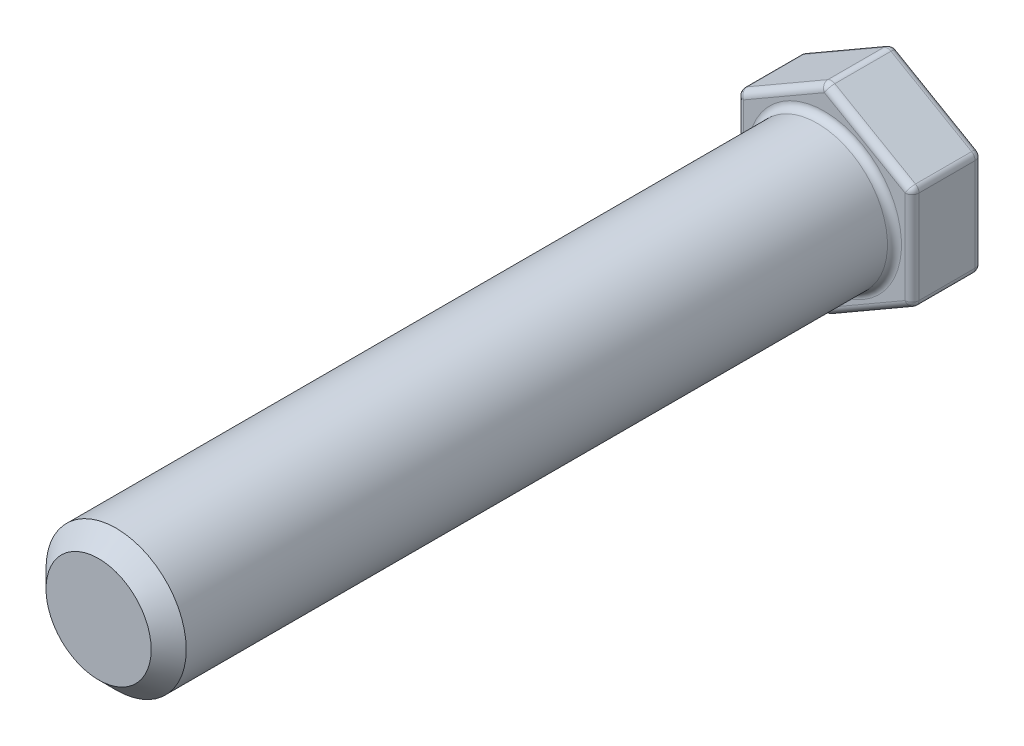
ISO-10303-21;
HEADER;
FILE_DESCRIPTION(('STEP AP214'),'2;1');
FILE_NAME('part.step','',(''),(''),'','','');
FILE_SCHEMA(('AUTOMOTIVE_DESIGN { 1 0 10303 214 1 1 1 1 }'));
ENDSEC;
DATA;
#1=APPLICATION_CONTEXT('core data for automotive mechanical design processes');
#2=APPLICATION_PROTOCOL_DEFINITION('international standard','automotive_design',2000,#1);
#3=PRODUCT_CONTEXT('',#1,'mechanical');
#4=PRODUCT('Part','Part','',(#3));
#5=PRODUCT_RELATED_PRODUCT_CATEGORY('part','',(#4));
#6=PRODUCT_DEFINITION_FORMATION('','',#4);
#7=PRODUCT_DEFINITION_CONTEXT('part definition',#1,'design');
#8=PRODUCT_DEFINITION('design','',#6,#7);
#9=PRODUCT_DEFINITION_SHAPE('','',#8);
#10=(LENGTH_UNIT() NAMED_UNIT(*) SI_UNIT(.MILLI.,.METRE.));
#11=(NAMED_UNIT(*) PLANE_ANGLE_UNIT() SI_UNIT($,.RADIAN.));
#12=(NAMED_UNIT(*) SI_UNIT($,.STERADIAN.) SOLID_ANGLE_UNIT());
#13=UNCERTAINTY_MEASURE_WITH_UNIT(LENGTH_MEASURE(1.E-05),#10,'distance_accuracy_value','');
#14=(GEOMETRIC_REPRESENTATION_CONTEXT(3) GLOBAL_UNCERTAINTY_ASSIGNED_CONTEXT((#13)) GLOBAL_UNIT_ASSIGNED_CONTEXT((#10,
#11,#12)) REPRESENTATION_CONTEXT('',''));
#15=CARTESIAN_POINT('',(0.,0.,0.));
#16=DIRECTION('',(0.,0.,1.));
#17=DIRECTION('',(1.,0.,0.));
#18=AXIS2_PLACEMENT_3D('',#15,#16,#17);
#19=CARTESIAN_POINT('',(0.,0.,20.7));
#20=DIRECTION('',(0.,0.,-1.));
#21=DIRECTION('',(-1.,0.,0.));
#22=AXIS2_PLACEMENT_3D('',#19,#20,#21);
#23=CYLINDRICAL_SURFACE('',#22,2.);
#24=CARTESIAN_POINT('',(0.,0.,20.2));
#25=DIRECTION('',(0.,0.,1.));
#26=DIRECTION('',(1.,0.,0.));
#27=AXIS2_PLACEMENT_3D('',#24,#25,#26);
#28=CIRCLE('',#27,2.);
#29=CARTESIAN_POINT('',(2.,0.,20.2));
#30=VERTEX_POINT('',#29);
#31=EDGE_CURVE('E11',#30,#30,#28,.F.);
#32=ORIENTED_EDGE('',*,*,#31,.T.);
#33=EDGE_LOOP('',(#32));
#34=FACE_BOUND('',#33,.T.);
#35=CARTESIAN_POINT('',(0.,0.,0.199999999999999));
#36=DIRECTION('',(0.,0.,-1.));
#37=DIRECTION('',(-1.,0.,0.));
#38=AXIS2_PLACEMENT_3D('',#35,#36,#37);
#39=CIRCLE('',#38,2.);
#40=CARTESIAN_POINT('',(-2.,0.,0.199999999999999));
#41=VERTEX_POINT('',#40);
#42=EDGE_CURVE('E768',#41,#41,#39,.F.);
#43=ORIENTED_EDGE('',*,*,#42,.T.);
#44=EDGE_LOOP('',(#43));
#45=FACE_BOUND('',#44,.T.);
#46=ADVANCED_FACE('F34',(#34,#45),#23,.T.);
#47=CARTESIAN_POINT('',(0.,0.,20.7));
#48=DIRECTION('',(0.,0.,1.));
#49=DIRECTION('',(1.,0.,0.));
#50=AXIS2_PLACEMENT_3D('',#47,#48,#49);
#51=PLANE('',#50);
#52=CARTESIAN_POINT('',(0.,0.,20.7));
#53=DIRECTION('',(0.,0.,1.));
#54=DIRECTION('',(1.,0.,0.));
#55=AXIS2_PLACEMENT_3D('',#52,#53,#54);
#56=CIRCLE('',#55,1.5);
#57=CARTESIAN_POINT('',(1.5,0.,20.7));
#58=VERTEX_POINT('',#57);
#59=EDGE_CURVE('E42',#58,#58,#56,.T.);
#60=ORIENTED_EDGE('',*,*,#59,.T.);
#61=EDGE_LOOP('',(#60));
#62=FACE_BOUND('',#61,.T.);
#63=ADVANCED_FACE('F296',(#62),#51,.T.);
#64=CARTESIAN_POINT('',(0.,2.88675134594813,-2.));
#65=DIRECTION('',(-0.5,-0.866025403784438,0.));
#66=DIRECTION('',(0.866025403784438,-0.5,0.));
#67=AXIS2_PLACEMENT_3D('',#64,#65,#66);
#68=PLANE('',#67);
#69=DIRECTION('',(0.866025403784438,-0.5,0.));
#70=VECTOR('',#69,1.);
#71=CARTESIAN_POINT('',(0.,2.88675134594813,-1.8));
#72=LINE('',#71,#70);
#73=CARTESIAN_POINT('',(2.4,1.50111069989303,-1.8));
#74=VERTEX_POINT('',#73);
#75=CARTESIAN_POINT('',(0.100000000000001,2.82901631902917,-1.8));
#76=VERTEX_POINT('',#75);
#77=EDGE_CURVE('E762',#74,#76,#72,.F.);
#78=ORIENTED_EDGE('',*,*,#77,.T.);
#79=DIRECTION('',(0.,0.,1.));
#80=VECTOR('',#79,1.);
#81=CARTESIAN_POINT('',(0.100000000000001,2.82901631902917,-2.));
#82=LINE('',#81,#80);
#83=CARTESIAN_POINT('',(0.100000000000001,2.82901631902917,-0.2));
#84=VERTEX_POINT('',#83);
#85=EDGE_CURVE('E241',#76,#84,#82,.T.);
#86=ORIENTED_EDGE('',*,*,#85,.T.);
#87=DIRECTION('',(0.866025403784438,-0.5,0.));
#88=VECTOR('',#87,1.);
#89=CARTESIAN_POINT('',(0.,2.88675134594813,-0.2));
#90=LINE('',#89,#88);
#91=CARTESIAN_POINT('',(2.4,1.50111069989303,-0.2));
#92=VERTEX_POINT('',#91);
#93=EDGE_CURVE('E779',#84,#92,#90,.T.);
#94=ORIENTED_EDGE('',*,*,#93,.T.);
#95=DIRECTION('',(0.,0.,1.));
#96=VECTOR('',#95,1.);
#97=CARTESIAN_POINT('',(2.4,1.50111069989303,-2.));
#98=LINE('',#97,#96);
#99=EDGE_CURVE('E239',#92,#74,#98,.F.);
#100=ORIENTED_EDGE('',*,*,#99,.T.);
#101=EDGE_LOOP('',(#78,#86,#94,#100));
#102=FACE_BOUND('',#101,.T.);
#103=ADVANCED_FACE('F314',(#102),#68,.F.);
#104=CARTESIAN_POINT('',(2.5,1.44337567297406,-2.));
#105=DIRECTION('',(-1.,0.,0.));
#106=DIRECTION('',(0.,-1.,0.));
#107=AXIS2_PLACEMENT_3D('',#104,#105,#106);
#108=PLANE('',#107);
#109=DIRECTION('',(0.,-1.,0.));
#110=VECTOR('',#109,1.);
#111=CARTESIAN_POINT('',(2.5,1.44337567297406,-0.2));
#112=LINE('',#111,#110);
#113=CARTESIAN_POINT('',(2.5,1.32790561913614,-0.2));
#114=VERTEX_POINT('',#113);
#115=CARTESIAN_POINT('',(2.5,-1.32790561913614,-0.2));
#116=VERTEX_POINT('',#115);
#117=EDGE_CURVE('E164',#114,#116,#112,.T.);
#118=ORIENTED_EDGE('',*,*,#117,.T.);
#119=DIRECTION('',(0.,0.,1.));
#120=VECTOR('',#119,1.);
#121=CARTESIAN_POINT('',(2.5,-1.32790561913614,-2.));
#122=LINE('',#121,#120);
#123=CARTESIAN_POINT('',(2.5,-1.32790561913614,-1.8));
#124=VERTEX_POINT('',#123);
#125=EDGE_CURVE('E260',#116,#124,#122,.F.);
#126=ORIENTED_EDGE('',*,*,#125,.T.);
#127=DIRECTION('',(0.,-1.,0.));
#128=VECTOR('',#127,1.);
#129=CARTESIAN_POINT('',(2.5,1.44337567297406,-1.8));
#130=LINE('',#129,#128);
#131=CARTESIAN_POINT('',(2.5,1.32790561913614,-1.8));
#132=VERTEX_POINT('',#131);
#133=EDGE_CURVE('E269',#124,#132,#130,.F.);
#134=ORIENTED_EDGE('',*,*,#133,.T.);
#135=DIRECTION('',(0.,0.,1.));
#136=VECTOR('',#135,1.);
#137=CARTESIAN_POINT('',(2.5,1.32790561913614,-2.));
#138=LINE('',#137,#136);
#139=EDGE_CURVE('E56',#132,#114,#138,.T.);
#140=ORIENTED_EDGE('',*,*,#139,.T.);
#141=EDGE_LOOP('',(#118,#126,#134,#140));
#142=FACE_BOUND('',#141,.T.);
#143=ADVANCED_FACE('F466',(#142),#108,.F.);
#144=CARTESIAN_POINT('',(2.5,-1.44337567297406,-2.));
#145=DIRECTION('',(-0.5,0.866025403784439,0.));
#146=DIRECTION('',(-0.866025403784439,-0.5,0.));
#147=AXIS2_PLACEMENT_3D('',#144,#145,#146);
#148=PLANE('',#147);
#149=DIRECTION('',(-0.866025403784439,-0.5,0.));
#150=VECTOR('',#149,1.);
#151=CARTESIAN_POINT('',(2.5,-1.44337567297406,-0.2));
#152=LINE('',#151,#150);
#153=CARTESIAN_POINT('',(2.4,-1.50111069989303,-0.2));
#154=VERTEX_POINT('',#153);
#155=CARTESIAN_POINT('',(0.0999999999999998,-2.82901631902917,-0.2));
#156=VERTEX_POINT('',#155);
#157=EDGE_CURVE('E799',#154,#156,#152,.T.);
#158=ORIENTED_EDGE('',*,*,#157,.T.);
#159=DIRECTION('',(0.,0.,1.));
#160=VECTOR('',#159,1.);
#161=CARTESIAN_POINT('',(0.0999999999999994,-2.82901631902917,-2.));
#162=LINE('',#161,#160);
#163=CARTESIAN_POINT('',(0.1,-2.82901631902917,-1.8));
#164=VERTEX_POINT('',#163);
#165=EDGE_CURVE('E257',#156,#164,#162,.F.);
#166=ORIENTED_EDGE('',*,*,#165,.T.);
#167=DIRECTION('',(-0.866025403784439,-0.5,0.));
#168=VECTOR('',#167,1.);
#169=CARTESIAN_POINT('',(2.5,-1.44337567297406,-1.8));
#170=LINE('',#169,#168);
#171=CARTESIAN_POINT('',(2.4,-1.50111069989303,-1.8));
#172=VERTEX_POINT('',#171);
#173=EDGE_CURVE('E192',#164,#172,#170,.F.);
#174=ORIENTED_EDGE('',*,*,#173,.T.);
#175=DIRECTION('',(0.,0.,1.));
#176=VECTOR('',#175,1.);
#177=CARTESIAN_POINT('',(2.4,-1.50111069989303,-2.));
#178=LINE('',#177,#176);
#179=EDGE_CURVE('E255',#172,#154,#178,.T.);
#180=ORIENTED_EDGE('',*,*,#179,.T.);
#181=EDGE_LOOP('',(#158,#166,#174,#180));
#182=FACE_BOUND('',#181,.T.);
#183=ADVANCED_FACE('F473',(#182),#148,.F.);
#184=CARTESIAN_POINT('',(0.,-2.88675134594813,-2.));
#185=DIRECTION('',(0.5,0.866025403784438,0.));
#186=DIRECTION('',(-0.866025403784438,0.5,0.));
#187=AXIS2_PLACEMENT_3D('',#184,#185,#186);
#188=PLANE('',#187);
#189=DIRECTION('',(-0.866025403784438,0.5,0.));
#190=VECTOR('',#189,1.);
#191=CARTESIAN_POINT('',(0.,-2.88675134594813,-0.2));
#192=LINE('',#191,#190);
#193=CARTESIAN_POINT('',(-0.1,-2.82901631902917,-0.2));
#194=VERTEX_POINT('',#193);
#195=CARTESIAN_POINT('',(-2.4,-1.50111069989303,-0.2));
#196=VERTEX_POINT('',#195);
#197=EDGE_CURVE('E793',#194,#196,#192,.T.);
#198=ORIENTED_EDGE('',*,*,#197,.T.);
#199=DIRECTION('',(0.,0.,1.));
#200=VECTOR('',#199,1.);
#201=CARTESIAN_POINT('',(-2.4,-1.50111069989303,-2.));
#202=LINE('',#201,#200);
#203=CARTESIAN_POINT('',(-2.4,-1.50111069989303,-1.8));
#204=VERTEX_POINT('',#203);
#205=EDGE_CURVE('E253',#196,#204,#202,.F.);
#206=ORIENTED_EDGE('',*,*,#205,.T.);
#207=DIRECTION('',(-0.866025403784438,0.5,0.));
#208=VECTOR('',#207,1.);
#209=CARTESIAN_POINT('',(0.,-2.88675134594813,-1.8));
#210=LINE('',#209,#208);
#211=CARTESIAN_POINT('',(-0.1,-2.82901631902917,-1.8));
#212=VERTEX_POINT('',#211);
#213=EDGE_CURVE('E796',#204,#212,#210,.F.);
#214=ORIENTED_EDGE('',*,*,#213,.T.);
#215=DIRECTION('',(0.,0.,1.));
#216=VECTOR('',#215,1.);
#217=CARTESIAN_POINT('',(-0.1,-2.82901631902917,-2.));
#218=LINE('',#217,#216);
#219=EDGE_CURVE('E251',#212,#194,#218,.T.);
#220=ORIENTED_EDGE('',*,*,#219,.T.);
#221=EDGE_LOOP('',(#198,#206,#214,#220));
#222=FACE_BOUND('',#221,.T.);
#223=ADVANCED_FACE('F480',(#222),#188,.F.);
#224=CARTESIAN_POINT('',(-2.5,-1.44337567297406,-2.));
#225=DIRECTION('',(1.,0.,0.));
#226=DIRECTION('',(0.,1.,0.));
#227=AXIS2_PLACEMENT_3D('',#224,#225,#226);
#228=PLANE('',#227);
#229=DIRECTION('',(0.,1.,0.));
#230=VECTOR('',#229,1.);
#231=CARTESIAN_POINT('',(-2.5,-1.44337567297406,-0.2));
#232=LINE('',#231,#230);
#233=CARTESIAN_POINT('',(-2.5,-1.32790561913614,-0.2));
#234=VERTEX_POINT('',#233);
#235=CARTESIAN_POINT('',(-2.5,1.32790561913614,-0.2));
#236=VERTEX_POINT('',#235);
#237=EDGE_CURVE('E787',#234,#236,#232,.T.);
#238=ORIENTED_EDGE('',*,*,#237,.T.);
#239=DIRECTION('',(0.,0.,1.));
#240=VECTOR('',#239,1.);
#241=CARTESIAN_POINT('',(-2.5,1.32790561913614,-2.));
#242=LINE('',#241,#240);
#243=CARTESIAN_POINT('',(-2.5,1.32790561913614,-1.8));
#244=VERTEX_POINT('',#243);
#245=EDGE_CURVE('E249',#236,#244,#242,.F.);
#246=ORIENTED_EDGE('',*,*,#245,.T.);
#247=DIRECTION('',(0.,1.,0.));
#248=VECTOR('',#247,1.);
#249=CARTESIAN_POINT('',(-2.5,-1.44337567297406,-1.8));
#250=LINE('',#249,#248);
#251=CARTESIAN_POINT('',(-2.5,-1.32790561913614,-1.8));
#252=VERTEX_POINT('',#251);
#253=EDGE_CURVE('E790',#244,#252,#250,.F.);
#254=ORIENTED_EDGE('',*,*,#253,.T.);
#255=DIRECTION('',(0.,0.,1.));
#256=VECTOR('',#255,1.);
#257=CARTESIAN_POINT('',(-2.5,-1.32790561913614,-2.));
#258=LINE('',#257,#256);
#259=EDGE_CURVE('E247',#252,#234,#258,.T.);
#260=ORIENTED_EDGE('',*,*,#259,.T.);
#261=EDGE_LOOP('',(#238,#246,#254,#260));
#262=FACE_BOUND('',#261,.T.);
#263=ADVANCED_FACE('F488',(#262),#228,.F.);
#264=CARTESIAN_POINT('',(-2.5,1.44337567297406,-2.));
#265=DIRECTION('',(0.5,-0.866025403784439,0.));
#266=DIRECTION('',(0.866025403784439,0.5,0.));
#267=AXIS2_PLACEMENT_3D('',#264,#265,#266);
#268=PLANE('',#267);
#269=DIRECTION('',(0.866025403784439,0.5,0.));
#270=VECTOR('',#269,1.);
#271=CARTESIAN_POINT('',(-2.5,1.44337567297406,-0.2));
#272=LINE('',#271,#270);
#273=CARTESIAN_POINT('',(-2.4,1.50111069989303,-0.2));
#274=VERTEX_POINT('',#273);
#275=CARTESIAN_POINT('',(-0.099999999999999,2.82901631902917,-0.2));
#276=VERTEX_POINT('',#275);
#277=EDGE_CURVE('E782',#274,#276,#272,.T.);
#278=ORIENTED_EDGE('',*,*,#277,.T.);
#279=DIRECTION('',(0.,0.,1.));
#280=VECTOR('',#279,1.);
#281=CARTESIAN_POINT('',(-0.099999999999999,2.82901631902917,-2.));
#282=LINE('',#281,#280);
#283=CARTESIAN_POINT('',(-0.0999999999999985,2.82901631902917,-1.8));
#284=VERTEX_POINT('',#283);
#285=EDGE_CURVE('E245',#276,#284,#282,.F.);
#286=ORIENTED_EDGE('',*,*,#285,.T.);
#287=DIRECTION('',(0.866025403784439,0.5,0.));
#288=VECTOR('',#287,1.);
#289=CARTESIAN_POINT('',(-2.5,1.44337567297406,-1.8));
#290=LINE('',#289,#288);
#291=CARTESIAN_POINT('',(-2.4,1.50111069989303,-1.8));
#292=VERTEX_POINT('',#291);
#293=EDGE_CURVE('E785',#284,#292,#290,.F.);
#294=ORIENTED_EDGE('',*,*,#293,.T.);
#295=DIRECTION('',(0.,0.,1.));
#296=VECTOR('',#295,1.);
#297=CARTESIAN_POINT('',(-2.4,1.50111069989303,-2.));
#298=LINE('',#297,#296);
#299=EDGE_CURVE('E243',#292,#274,#298,.T.);
#300=ORIENTED_EDGE('',*,*,#299,.T.);
#301=EDGE_LOOP('',(#278,#286,#294,#300));
#302=FACE_BOUND('',#301,.T.);
#303=ADVANCED_FACE('F496',(#302),#268,.F.);
#304=CARTESIAN_POINT('',(0.,0.,-2.));
#305=DIRECTION('',(0.,0.,-1.));
#306=DIRECTION('',(-1.,0.,0.));
#307=AXIS2_PLACEMENT_3D('',#304,#305,#306);
#308=PLANE('',#307);
#309=DIRECTION('',(0.,1.,0.));
#310=VECTOR('',#309,1.);
#311=CARTESIAN_POINT('',(-2.3,1.44337567297406,-2.));
#312=LINE('',#311,#310);
#313=CARTESIAN_POINT('',(-2.3,-1.32790561913614,-2.));
#314=VERTEX_POINT('',#313);
#315=CARTESIAN_POINT('',(-2.3,1.32790561913614,-2.));
#316=VERTEX_POINT('',#315);
#317=EDGE_CURVE('E733',#314,#316,#312,.T.);
#318=ORIENTED_EDGE('',*,*,#317,.T.);
#319=DIRECTION('',(0.866025403784439,0.5,0.));
#320=VECTOR('',#319,1.);
#321=CARTESIAN_POINT('',(0.100000000000001,2.71354626519124,-2.));
#322=LINE('',#321,#320);
#323=CARTESIAN_POINT('',(0.,2.65581123827228,-2.));
#324=VERTEX_POINT('',#323);
#325=EDGE_CURVE('E736',#316,#324,#322,.T.);
#326=ORIENTED_EDGE('',*,*,#325,.T.);
#327=DIRECTION('',(0.866025403784438,-0.5,0.));
#328=VECTOR('',#327,1.);
#329=CARTESIAN_POINT('',(2.4,1.27017059221718,-2.));
#330=LINE('',#329,#328);
#331=CARTESIAN_POINT('',(2.3,1.32790561913614,-2.));
#332=VERTEX_POINT('',#331);
#333=EDGE_CURVE('E760',#324,#332,#330,.T.);
#334=ORIENTED_EDGE('',*,*,#333,.T.);
#335=DIRECTION('',(0.,-1.,0.));
#336=VECTOR('',#335,1.);
#337=CARTESIAN_POINT('',(2.3,-1.44337567297406,-2.));
#338=LINE('',#337,#336);
#339=CARTESIAN_POINT('',(2.3,-1.32790561913614,-2.));
#340=VERTEX_POINT('',#339);
#341=EDGE_CURVE('E766',#332,#340,#338,.T.);
#342=ORIENTED_EDGE('',*,*,#341,.T.);
#343=DIRECTION('',(-0.866025403784439,-0.5,0.));
#344=VECTOR('',#343,1.);
#345=CARTESIAN_POINT('',(-0.1,-2.71354626519124,-2.));
#346=LINE('',#345,#344);
#347=CARTESIAN_POINT('',(0.,-2.65581123827228,-2.));
#348=VERTEX_POINT('',#347);
#349=EDGE_CURVE('E772',#340,#348,#346,.T.);
#350=ORIENTED_EDGE('',*,*,#349,.T.);
#351=DIRECTION('',(-0.866025403784438,0.5,0.));
#352=VECTOR('',#351,1.);
#353=CARTESIAN_POINT('',(-2.4,-1.27017059221718,-2.));
#354=LINE('',#353,#352);
#355=EDGE_CURVE('E739',#348,#314,#354,.T.);
#356=ORIENTED_EDGE('',*,*,#355,.T.);
#357=EDGE_LOOP('',(#318,#326,#334,#342,#350,#356));
#358=FACE_BOUND('',#357,.T.);
#359=ADVANCED_FACE('F504',(#358),#308,.T.);
#360=CARTESIAN_POINT('',(0.,0.,0.));
#361=DIRECTION('',(0.,0.,-1.));
#362=DIRECTION('',(-1.,0.,0.));
#363=AXIS2_PLACEMENT_3D('',#360,#361,#362);
#364=PLANE('',#363);
#365=DIRECTION('',(-0.866025403784439,-0.5,0.));
#366=VECTOR('',#365,1.);
#367=CARTESIAN_POINT('',(1.15,-1.99185842870421,0.));
#368=LINE('',#367,#366);
#369=CARTESIAN_POINT('',(0.,-2.65581123827228,0.));
#370=VERTEX_POINT('',#369);
#371=CARTESIAN_POINT('',(2.3,-1.32790561913614,0.));
#372=VERTEX_POINT('',#371);
#373=EDGE_CURVE('E191',#370,#372,#368,.F.);
#374=ORIENTED_EDGE('',*,*,#373,.T.);
#375=DIRECTION('',(0.,-1.,0.));
#376=VECTOR('',#375,1.);
#377=CARTESIAN_POINT('',(2.3,0.,0.));
#378=LINE('',#377,#376);
#379=CARTESIAN_POINT('',(2.3,1.32790561913614,0.));
#380=VERTEX_POINT('',#379);
#381=EDGE_CURVE('E163',#372,#380,#378,.F.);
#382=ORIENTED_EDGE('',*,*,#381,.T.);
#383=DIRECTION('',(0.866025403784438,-0.5,0.));
#384=VECTOR('',#383,1.);
#385=CARTESIAN_POINT('',(1.15,1.99185842870421,0.));
#386=LINE('',#385,#384);
#387=CARTESIAN_POINT('',(0.,2.65581123827228,0.));
#388=VERTEX_POINT('',#387);
#389=EDGE_CURVE('E173',#380,#388,#386,.F.);
#390=ORIENTED_EDGE('',*,*,#389,.T.);
#391=DIRECTION('',(0.866025403784439,0.5,0.));
#392=VECTOR('',#391,1.);
#393=CARTESIAN_POINT('',(-1.15,1.99185842870421,0.));
#394=LINE('',#393,#392);
#395=CARTESIAN_POINT('',(-2.3,1.32790561913614,0.));
#396=VERTEX_POINT('',#395);
#397=EDGE_CURVE('E183',#388,#396,#394,.F.);
#398=ORIENTED_EDGE('',*,*,#397,.T.);
#399=DIRECTION('',(0.,1.,0.));
#400=VECTOR('',#399,1.);
#401=CARTESIAN_POINT('',(-2.3,0.,0.));
#402=LINE('',#401,#400);
#403=CARTESIAN_POINT('',(-2.3,-1.32790561913614,0.));
#404=VERTEX_POINT('',#403);
#405=EDGE_CURVE('E807',#396,#404,#402,.F.);
#406=ORIENTED_EDGE('',*,*,#405,.T.);
#407=DIRECTION('',(-0.866025403784438,0.5,0.));
#408=VECTOR('',#407,1.);
#409=CARTESIAN_POINT('',(-1.15,-1.99185842870421,0.));
#410=LINE('',#409,#408);
#411=EDGE_CURVE('E805',#404,#370,#410,.F.);
#412=ORIENTED_EDGE('',*,*,#411,.T.);
#413=EDGE_LOOP('',(#374,#382,#390,#398,#406,#412));
#414=FACE_BOUND('',#413,.T.);
#415=CARTESIAN_POINT('',(0.,0.,0.));
#416=DIRECTION('',(0.,0.,-1.));
#417=DIRECTION('',(-1.,0.,0.));
#418=AXIS2_PLACEMENT_3D('',#415,#416,#417);
#419=CIRCLE('',#418,2.2);
#420=CARTESIAN_POINT('',(-2.2,0.,0.));
#421=VERTEX_POINT('',#420);
#422=EDGE_CURVE('E184',#421,#421,#419,.T.);
#423=ORIENTED_EDGE('',*,*,#422,.T.);
#424=EDGE_LOOP('',(#423));
#425=FACE_BOUND('',#424,.T.);
#426=ADVANCED_FACE('F187',(#414,#425),#364,.F.);
#427=CARTESIAN_POINT('',(-2.3,-1.44337567297406,-0.2));
#428=DIRECTION('',(0.,1.,0.));
#429=DIRECTION('',(-1.,0.,0.));
#430=AXIS2_PLACEMENT_3D('',#427,#428,#429);
#431=CYLINDRICAL_SURFACE('',#430,0.2);
#432=ORIENTED_EDGE('',*,*,#405,.F.);
#433=CARTESIAN_POINT('',(-2.3,1.32790561913614,-0.2));
#434=DIRECTION('',(0.,1.,0.));
#435=DIRECTION('',(-1.,0.,0.));
#436=AXIS2_PLACEMENT_3D('',#433,#434,#435);
#437=CIRCLE('',#436,0.2);
#438=EDGE_CURVE('E215',#396,#236,#437,.F.);
#439=ORIENTED_EDGE('',*,*,#438,.T.);
#440=ORIENTED_EDGE('',*,*,#237,.F.);
#441=CARTESIAN_POINT('',(-2.3,-1.32790561913614,-0.2));
#442=DIRECTION('',(0.,1.,0.));
#443=DIRECTION('',(-1.,0.,0.));
#444=AXIS2_PLACEMENT_3D('',#441,#442,#443);
#445=CIRCLE('',#444,0.2);
#446=EDGE_CURVE('E213',#234,#404,#445,.T.);
#447=ORIENTED_EDGE('',*,*,#446,.T.);
#448=EDGE_LOOP('',(#432,#439,#440,#447));
#449=FACE_BOUND('',#448,.T.);
#450=ADVANCED_FACE('F335',(#449),#431,.T.);
#451=CARTESIAN_POINT('',(-2.4,1.27017059221718,-0.2));
#452=DIRECTION('',(0.866025403784439,0.5,0.));
#453=DIRECTION('',(-0.5,0.866025403784439,0.));
#454=AXIS2_PLACEMENT_3D('',#451,#452,#453);
#455=CYLINDRICAL_SURFACE('',#454,0.2);
#456=ORIENTED_EDGE('',*,*,#397,.F.);
#457=CARTESIAN_POINT('',(0.,2.65581123827228,-0.2));
#458=DIRECTION('',(0.866025403784439,0.5,0.));
#459=DIRECTION('',(-0.5,0.866025403784439,0.));
#460=AXIS2_PLACEMENT_3D('',#457,#458,#459);
#461=CIRCLE('',#460,0.2);
#462=EDGE_CURVE('E206',#388,#276,#461,.F.);
#463=ORIENTED_EDGE('',*,*,#462,.T.);
#464=ORIENTED_EDGE('',*,*,#277,.F.);
#465=CARTESIAN_POINT('',(-2.3,1.32790561913614,-0.2));
#466=DIRECTION('',(0.866025403784439,0.5,0.));
#467=DIRECTION('',(-0.5,0.866025403784439,0.));
#468=AXIS2_PLACEMENT_3D('',#465,#466,#467);
#469=CIRCLE('',#468,0.2);
#470=EDGE_CURVE('E199',#274,#396,#469,.T.);
#471=ORIENTED_EDGE('',*,*,#470,.T.);
#472=EDGE_LOOP('',(#456,#463,#464,#471));
#473=FACE_BOUND('',#472,.T.);
#474=ADVANCED_FACE('F331',(#473),#455,.T.);
#475=CARTESIAN_POINT('',(0.0999999999999997,-2.71354626519124,-0.2));
#476=DIRECTION('',(-0.866025403784438,0.5,0.));
#477=DIRECTION('',(-0.5,-0.866025403784438,0.));
#478=AXIS2_PLACEMENT_3D('',#475,#476,#477);
#479=CYLINDRICAL_SURFACE('',#478,0.2);
#480=ORIENTED_EDGE('',*,*,#411,.F.);
#481=CARTESIAN_POINT('',(-2.3,-1.32790561913614,-0.2));
#482=DIRECTION('',(-0.866025403784438,0.5,0.));
#483=DIRECTION('',(-0.5,-0.866025403784438,0.));
#484=AXIS2_PLACEMENT_3D('',#481,#482,#483);
#485=CIRCLE('',#484,0.2);
#486=EDGE_CURVE('E224',#404,#196,#485,.F.);
#487=ORIENTED_EDGE('',*,*,#486,.T.);
#488=ORIENTED_EDGE('',*,*,#197,.F.);
#489=CARTESIAN_POINT('',(0.,-2.65581123827228,-0.2));
#490=DIRECTION('',(-0.866025403784438,0.5,0.));
#491=DIRECTION('',(-0.5,-0.866025403784438,0.));
#492=AXIS2_PLACEMENT_3D('',#489,#490,#491);
#493=CIRCLE('',#492,0.2);
#494=EDGE_CURVE('E222',#194,#370,#493,.T.);
#495=ORIENTED_EDGE('',*,*,#494,.T.);
#496=EDGE_LOOP('',(#480,#487,#488,#495));
#497=FACE_BOUND('',#496,.T.);
#498=ADVANCED_FACE('F328',(#497),#479,.T.);
#499=CARTESIAN_POINT('',(-0.0999999999999992,2.71354626519124,-0.2));
#500=DIRECTION('',(0.866025403784438,-0.5,0.));
#501=DIRECTION('',(0.5,0.866025403784438,0.));
#502=AXIS2_PLACEMENT_3D('',#499,#500,#501);
#503=CYLINDRICAL_SURFACE('',#502,0.2);
#504=ORIENTED_EDGE('',*,*,#93,.F.);
#505=CARTESIAN_POINT('',(0.,2.65581123827228,-0.2));
#506=DIRECTION('',(0.866025403784438,-0.5,0.));
#507=DIRECTION('',(0.5,0.866025403784438,0.));
#508=AXIS2_PLACEMENT_3D('',#505,#506,#507);
#509=CIRCLE('',#508,0.2);
#510=EDGE_CURVE('E179',#84,#388,#509,.T.);
#511=ORIENTED_EDGE('',*,*,#510,.T.);
#512=ORIENTED_EDGE('',*,*,#389,.F.);
#513=CARTESIAN_POINT('',(2.3,1.32790561913614,-0.2));
#514=DIRECTION('',(0.866025403784438,-0.5,0.));
#515=DIRECTION('',(0.5,0.866025403784438,0.));
#516=AXIS2_PLACEMENT_3D('',#513,#514,#515);
#517=CIRCLE('',#516,0.2);
#518=EDGE_CURVE('E176',#380,#92,#517,.F.);
#519=ORIENTED_EDGE('',*,*,#518,.T.);
#520=EDGE_LOOP('',(#504,#511,#512,#519));
#521=FACE_BOUND('',#520,.T.);
#522=ADVANCED_FACE('F175',(#521),#503,.T.);
#523=CARTESIAN_POINT('',(2.4,-1.27017059221718,-0.2));
#524=DIRECTION('',(-0.866025403784439,-0.5,0.));
#525=DIRECTION('',(0.5,-0.866025403784439,0.));
#526=AXIS2_PLACEMENT_3D('',#523,#524,#525);
#527=CYLINDRICAL_SURFACE('',#526,0.2);
#528=ORIENTED_EDGE('',*,*,#373,.F.);
#529=CARTESIAN_POINT('',(0.,-2.65581123827228,-0.2));
#530=DIRECTION('',(-0.866025403784439,-0.5,0.));
#531=DIRECTION('',(0.5,-0.866025403784439,0.));
#532=AXIS2_PLACEMENT_3D('',#529,#530,#531);
#533=CIRCLE('',#532,0.2);
#534=EDGE_CURVE('E232',#370,#156,#533,.F.);
#535=ORIENTED_EDGE('',*,*,#534,.T.);
#536=ORIENTED_EDGE('',*,*,#157,.F.);
#537=CARTESIAN_POINT('',(2.3,-1.32790561913614,-0.2));
#538=DIRECTION('',(-0.866025403784439,-0.5,0.));
#539=DIRECTION('',(0.5,-0.866025403784439,0.));
#540=AXIS2_PLACEMENT_3D('',#537,#538,#539);
#541=CIRCLE('',#540,0.2);
#542=EDGE_CURVE('E230',#154,#372,#541,.T.);
#543=ORIENTED_EDGE('',*,*,#542,.T.);
#544=EDGE_LOOP('',(#528,#535,#536,#543));
#545=FACE_BOUND('',#544,.T.);
#546=ADVANCED_FACE('F322',(#545),#527,.T.);
#547=CARTESIAN_POINT('',(2.3,1.44337567297406,-0.2));
#548=DIRECTION('',(0.,-1.,0.));
#549=DIRECTION('',(1.,0.,0.));
#550=AXIS2_PLACEMENT_3D('',#547,#548,#549);
#551=CYLINDRICAL_SURFACE('',#550,0.2);
#552=ORIENTED_EDGE('',*,*,#381,.F.);
#553=CARTESIAN_POINT('',(2.3,-1.32790561913614,-0.2));
#554=DIRECTION('',(0.,-1.,0.));
#555=DIRECTION('',(1.,0.,0.));
#556=AXIS2_PLACEMENT_3D('',#553,#554,#555);
#557=CIRCLE('',#556,0.2);
#558=EDGE_CURVE('E49',#372,#116,#557,.F.);
#559=ORIENTED_EDGE('',*,*,#558,.T.);
#560=ORIENTED_EDGE('',*,*,#117,.F.);
#561=CARTESIAN_POINT('',(2.3,1.32790561913614,-0.2));
#562=DIRECTION('',(0.,-1.,0.));
#563=DIRECTION('',(1.,0.,0.));
#564=AXIS2_PLACEMENT_3D('',#561,#562,#563);
#565=CIRCLE('',#564,0.2);
#566=EDGE_CURVE('E159',#114,#380,#565,.T.);
#567=ORIENTED_EDGE('',*,*,#566,.T.);
#568=EDGE_LOOP('',(#552,#559,#560,#567));
#569=FACE_BOUND('',#568,.T.);
#570=ADVANCED_FACE('F161',(#569),#551,.T.);
#571=CARTESIAN_POINT('',(0.,0.,0.199999999999999));
#572=DIRECTION('',(0.,0.,-1.));
#573=DIRECTION('',(-1.,0.,0.));
#574=AXIS2_PLACEMENT_3D('',#571,#572,#573);
#575=TOROIDAL_SURFACE('',#574,2.2,0.2);
#576=ORIENTED_EDGE('',*,*,#42,.F.);
#577=EDGE_LOOP('',(#576));
#578=FACE_BOUND('',#577,.T.);
#579=ORIENTED_EDGE('',*,*,#422,.F.);
#580=EDGE_LOOP('',(#579));
#581=FACE_BOUND('',#580,.T.);
#582=ADVANCED_FACE('F321',(#578,#581),#575,.F.);
#583=CARTESIAN_POINT('',(1.15,-1.99185842870421,-1.8));
#584=DIRECTION('',(0.866025403784439,0.5,0.));
#585=DIRECTION('',(-0.5,0.866025403784439,0.));
#586=AXIS2_PLACEMENT_3D('',#583,#584,#585);
#587=CYLINDRICAL_SURFACE('',#586,0.2);
#588=ORIENTED_EDGE('',*,*,#173,.F.);
#589=CARTESIAN_POINT('',(0.,-2.65581123827228,-1.8));
#590=DIRECTION('',(0.866025403784439,0.5,0.));
#591=DIRECTION('',(-0.5,0.866025403784439,0.));
#592=AXIS2_PLACEMENT_3D('',#589,#590,#591);
#593=CIRCLE('',#592,0.2);
#594=EDGE_CURVE('E228',#164,#348,#593,.T.);
#595=ORIENTED_EDGE('',*,*,#594,.T.);
#596=ORIENTED_EDGE('',*,*,#349,.F.);
#597=CARTESIAN_POINT('',(2.3,-1.32790561913614,-1.8));
#598=DIRECTION('',(0.866025403784439,0.5,0.));
#599=DIRECTION('',(-0.5,0.866025403784439,0.));
#600=AXIS2_PLACEMENT_3D('',#597,#598,#599);
#601=CIRCLE('',#600,0.2);
#602=EDGE_CURVE('E226',#340,#172,#601,.F.);
#603=ORIENTED_EDGE('',*,*,#602,.T.);
#604=EDGE_LOOP('',(#588,#595,#596,#603));
#605=FACE_BOUND('',#604,.T.);
#606=ADVANCED_FACE('F342',(#605),#587,.T.);
#607=CARTESIAN_POINT('',(-1.15,-1.99185842870421,-1.8));
#608=DIRECTION('',(0.866025403784438,-0.5,0.));
#609=DIRECTION('',(0.5,0.866025403784438,0.));
#610=AXIS2_PLACEMENT_3D('',#607,#608,#609);
#611=CYLINDRICAL_SURFACE('',#610,0.2);
#612=ORIENTED_EDGE('',*,*,#213,.F.);
#613=CARTESIAN_POINT('',(-2.3,-1.32790561913614,-1.8));
#614=DIRECTION('',(0.866025403784438,-0.5,0.));
#615=DIRECTION('',(0.5,0.866025403784438,0.));
#616=AXIS2_PLACEMENT_3D('',#613,#614,#615);
#617=CIRCLE('',#616,0.2);
#618=EDGE_CURVE('E220',#204,#314,#617,.T.);
#619=ORIENTED_EDGE('',*,*,#618,.T.);
#620=ORIENTED_EDGE('',*,*,#355,.F.);
#621=CARTESIAN_POINT('',(0.,-2.65581123827228,-1.8));
#622=DIRECTION('',(0.866025403784438,-0.5,0.));
#623=DIRECTION('',(0.5,0.866025403784438,0.));
#624=AXIS2_PLACEMENT_3D('',#621,#622,#623);
#625=CIRCLE('',#624,0.2);
#626=EDGE_CURVE('E217',#348,#212,#625,.F.);
#627=ORIENTED_EDGE('',*,*,#626,.T.);
#628=EDGE_LOOP('',(#612,#619,#620,#627));
#629=FACE_BOUND('',#628,.T.);
#630=ADVANCED_FACE('F360',(#629),#611,.T.);
#631=CARTESIAN_POINT('',(2.3,0.,-1.8));
#632=DIRECTION('',(0.,1.,0.));
#633=DIRECTION('',(-1.,0.,0.));
#634=AXIS2_PLACEMENT_3D('',#631,#632,#633);
#635=CYLINDRICAL_SURFACE('',#634,0.2);
#636=ORIENTED_EDGE('',*,*,#133,.F.);
#637=CARTESIAN_POINT('',(2.3,-1.32790561913614,-1.8));
#638=DIRECTION('',(0.,1.,0.));
#639=DIRECTION('',(-1.,0.,0.));
#640=AXIS2_PLACEMENT_3D('',#637,#638,#639);
#641=CIRCLE('',#640,0.2);
#642=EDGE_CURVE('E169',#124,#340,#641,.T.);
#643=ORIENTED_EDGE('',*,*,#642,.T.);
#644=ORIENTED_EDGE('',*,*,#341,.F.);
#645=CARTESIAN_POINT('',(2.3,1.32790561913614,-1.8));
#646=DIRECTION('',(0.,1.,0.));
#647=DIRECTION('',(-1.,0.,0.));
#648=AXIS2_PLACEMENT_3D('',#645,#646,#647);
#649=CIRCLE('',#648,0.2);
#650=EDGE_CURVE('E234',#332,#132,#649,.F.);
#651=ORIENTED_EDGE('',*,*,#650,.T.);
#652=EDGE_LOOP('',(#636,#643,#644,#651));
#653=FACE_BOUND('',#652,.T.);
#654=ADVANCED_FACE('F356',(#653),#635,.T.);
#655=CARTESIAN_POINT('',(-2.3,0.,-1.8));
#656=DIRECTION('',(0.,-1.,0.));
#657=DIRECTION('',(1.,0.,0.));
#658=AXIS2_PLACEMENT_3D('',#655,#656,#657);
#659=CYLINDRICAL_SURFACE('',#658,0.2);
#660=ORIENTED_EDGE('',*,*,#253,.F.);
#661=CARTESIAN_POINT('',(-2.3,1.32790561913614,-1.8));
#662=DIRECTION('',(0.,-1.,0.));
#663=DIRECTION('',(1.,0.,0.));
#664=AXIS2_PLACEMENT_3D('',#661,#662,#663);
#665=CIRCLE('',#664,0.2);
#666=EDGE_CURVE('E211',#244,#316,#665,.T.);
#667=ORIENTED_EDGE('',*,*,#666,.T.);
#668=ORIENTED_EDGE('',*,*,#317,.F.);
#669=CARTESIAN_POINT('',(-2.3,-1.32790561913614,-1.8));
#670=DIRECTION('',(0.,-1.,0.));
#671=DIRECTION('',(1.,0.,0.));
#672=AXIS2_PLACEMENT_3D('',#669,#670,#671);
#673=CIRCLE('',#672,0.2);
#674=EDGE_CURVE('E208',#314,#252,#673,.F.);
#675=ORIENTED_EDGE('',*,*,#674,.T.);
#676=EDGE_LOOP('',(#660,#667,#668,#675));
#677=FACE_BOUND('',#676,.T.);
#678=ADVANCED_FACE('F352',(#677),#659,.T.);
#679=CARTESIAN_POINT('',(1.15,1.99185842870421,-1.8));
#680=DIRECTION('',(-0.866025403784438,0.5,0.));
#681=DIRECTION('',(-0.5,-0.866025403784438,0.));
#682=AXIS2_PLACEMENT_3D('',#679,#680,#681);
#683=CYLINDRICAL_SURFACE('',#682,0.2);
#684=ORIENTED_EDGE('',*,*,#333,.F.);
#685=CARTESIAN_POINT('',(0.,2.65581123827228,-1.8));
#686=DIRECTION('',(-0.866025403784438,0.5,0.));
#687=DIRECTION('',(-0.5,-0.866025403784438,0.));
#688=AXIS2_PLACEMENT_3D('',#685,#686,#687);
#689=CIRCLE('',#688,0.2);
#690=EDGE_CURVE('E197',#324,#76,#689,.F.);
#691=ORIENTED_EDGE('',*,*,#690,.T.);
#692=ORIENTED_EDGE('',*,*,#77,.F.);
#693=CARTESIAN_POINT('',(2.3,1.32790561913614,-1.8));
#694=DIRECTION('',(-0.866025403784438,0.5,0.));
#695=DIRECTION('',(-0.5,-0.866025403784438,0.));
#696=AXIS2_PLACEMENT_3D('',#693,#694,#695);
#697=CIRCLE('',#696,0.2);
#698=EDGE_CURVE('E201',#74,#332,#697,.T.);
#699=ORIENTED_EDGE('',*,*,#698,.T.);
#700=EDGE_LOOP('',(#684,#691,#692,#699));
#701=FACE_BOUND('',#700,.T.);
#702=ADVANCED_FACE('F348',(#701),#683,.T.);
#703=CARTESIAN_POINT('',(-1.15,1.99185842870421,-1.8));
#704=DIRECTION('',(-0.866025403784439,-0.5,0.));
#705=DIRECTION('',(0.5,-0.866025403784439,0.));
#706=AXIS2_PLACEMENT_3D('',#703,#704,#705);
#707=CYLINDRICAL_SURFACE('',#706,0.2);
#708=ORIENTED_EDGE('',*,*,#293,.F.);
#709=CARTESIAN_POINT('',(0.,2.65581123827228,-1.8));
#710=DIRECTION('',(-0.866025403784439,-0.5,0.));
#711=DIRECTION('',(0.5,-0.866025403784439,0.));
#712=AXIS2_PLACEMENT_3D('',#709,#710,#711);
#713=CIRCLE('',#712,0.2);
#714=EDGE_CURVE('E749',#284,#324,#713,.T.);
#715=ORIENTED_EDGE('',*,*,#714,.T.);
#716=ORIENTED_EDGE('',*,*,#325,.F.);
#717=CARTESIAN_POINT('',(-2.3,1.32790561913614,-1.8));
#718=DIRECTION('',(-0.866025403784439,-0.5,0.));
#719=DIRECTION('',(0.5,-0.866025403784439,0.));
#720=AXIS2_PLACEMENT_3D('',#717,#718,#719);
#721=CIRCLE('',#720,0.2);
#722=EDGE_CURVE('E746',#316,#292,#721,.F.);
#723=ORIENTED_EDGE('',*,*,#722,.T.);
#724=EDGE_LOOP('',(#708,#715,#716,#723));
#725=FACE_BOUND('',#724,.T.);
#726=ADVANCED_FACE('F344',(#725),#707,.T.);
#727=CARTESIAN_POINT('',(0.,2.65581123827228,-0.2));
#728=DIRECTION('',(0.,0.,1.));
#729=DIRECTION('',(1.,0.,0.));
#730=AXIS2_PLACEMENT_3D('',#727,#728,#729);
#731=SPHERICAL_SURFACE('',#730,0.2);
#732=ORIENTED_EDGE('',*,*,#462,.F.);
#733=ORIENTED_EDGE('',*,*,#510,.F.);
#734=CARTESIAN_POINT('',(0.,2.65581123827228,-0.2));
#735=DIRECTION('',(0.,0.,-1.));
#736=DIRECTION('',(-1.,0.,0.));
#737=AXIS2_PLACEMENT_3D('',#734,#735,#736);
#738=CIRCLE('',#737,0.2);
#739=EDGE_CURVE('E265',#276,#84,#738,.T.);
#740=ORIENTED_EDGE('',*,*,#739,.F.);
#741=EDGE_LOOP('',(#732,#733,#740));
#742=FACE_BOUND('',#741,.T.);
#743=ADVANCED_FACE('F347',(#742),#731,.T.);
#744=CARTESIAN_POINT('',(0.,2.65581123827228,-2.));
#745=DIRECTION('',(0.,0.,1.));
#746=DIRECTION('',(1.,0.,0.));
#747=AXIS2_PLACEMENT_3D('',#744,#745,#746);
#748=CYLINDRICAL_SURFACE('',#747,0.2);
#749=ORIENTED_EDGE('',*,*,#739,.T.);
#750=ORIENTED_EDGE('',*,*,#85,.F.);
#751=CARTESIAN_POINT('',(0.,2.65581123827228,-1.8));
#752=DIRECTION('',(0.,0.,-1.));
#753=DIRECTION('',(-1.,0.,0.));
#754=AXIS2_PLACEMENT_3D('',#751,#752,#753);
#755=CIRCLE('',#754,0.2);
#756=EDGE_CURVE('E262',#284,#76,#755,.T.);
#757=ORIENTED_EDGE('',*,*,#756,.F.);
#758=ORIENTED_EDGE('',*,*,#285,.F.);
#759=EDGE_LOOP('',(#749,#750,#757,#758));
#760=FACE_BOUND('',#759,.T.);
#761=ADVANCED_FACE('F372',(#760),#748,.T.);
#762=CARTESIAN_POINT('',(0.,2.65581123827228,-1.8));
#763=DIRECTION('',(0.,0.,1.));
#764=DIRECTION('',(1.,0.,0.));
#765=AXIS2_PLACEMENT_3D('',#762,#763,#764);
#766=SPHERICAL_SURFACE('',#765,0.2);
#767=ORIENTED_EDGE('',*,*,#756,.T.);
#768=ORIENTED_EDGE('',*,*,#690,.F.);
#769=ORIENTED_EDGE('',*,*,#714,.F.);
#770=EDGE_LOOP('',(#767,#768,#769));
#771=FACE_BOUND('',#770,.T.);
#772=ADVANCED_FACE('F368',(#771),#766,.T.);
#773=CARTESIAN_POINT('',(-2.3,1.32790561913614,-0.2));
#774=DIRECTION('',(0.,0.,1.));
#775=DIRECTION('',(1.,0.,0.));
#776=AXIS2_PLACEMENT_3D('',#773,#774,#775);
#777=SPHERICAL_SURFACE('',#776,0.2);
#778=ORIENTED_EDGE('',*,*,#438,.F.);
#779=ORIENTED_EDGE('',*,*,#470,.F.);
#780=CARTESIAN_POINT('',(-2.3,1.32790561913614,-0.2));
#781=DIRECTION('',(0.,0.,-1.));
#782=DIRECTION('',(-1.,0.,0.));
#783=AXIS2_PLACEMENT_3D('',#780,#781,#782);
#784=CIRCLE('',#783,0.2);
#785=EDGE_CURVE('E266',#236,#274,#784,.T.);
#786=ORIENTED_EDGE('',*,*,#785,.F.);
#787=EDGE_LOOP('',(#778,#779,#786));
#788=FACE_BOUND('',#787,.T.);
#789=ADVANCED_FACE('F371',(#788),#777,.T.);
#790=CARTESIAN_POINT('',(-2.3,1.32790561913614,-2.));
#791=DIRECTION('',(0.,0.,1.));
#792=DIRECTION('',(1.,0.,0.));
#793=AXIS2_PLACEMENT_3D('',#790,#791,#792);
#794=CYLINDRICAL_SURFACE('',#793,0.2);
#795=ORIENTED_EDGE('',*,*,#785,.T.);
#796=ORIENTED_EDGE('',*,*,#299,.F.);
#797=CARTESIAN_POINT('',(-2.3,1.32790561913614,-1.8));
#798=DIRECTION('',(0.,0.,-1.));
#799=DIRECTION('',(-1.,0.,0.));
#800=AXIS2_PLACEMENT_3D('',#797,#798,#799);
#801=CIRCLE('',#800,0.2);
#802=EDGE_CURVE('E270',#244,#292,#801,.T.);
#803=ORIENTED_EDGE('',*,*,#802,.F.);
#804=ORIENTED_EDGE('',*,*,#245,.F.);
#805=EDGE_LOOP('',(#795,#796,#803,#804));
#806=FACE_BOUND('',#805,.T.);
#807=ADVANCED_FACE('F384',(#806),#794,.T.);
#808=CARTESIAN_POINT('',(-2.3,1.32790561913614,-1.8));
#809=DIRECTION('',(0.,0.,1.));
#810=DIRECTION('',(1.,0.,0.));
#811=AXIS2_PLACEMENT_3D('',#808,#809,#810);
#812=SPHERICAL_SURFACE('',#811,0.2);
#813=ORIENTED_EDGE('',*,*,#722,.F.);
#814=ORIENTED_EDGE('',*,*,#666,.F.);
#815=ORIENTED_EDGE('',*,*,#802,.T.);
#816=EDGE_LOOP('',(#813,#814,#815));
#817=FACE_BOUND('',#816,.T.);
#818=ADVANCED_FACE('F380',(#817),#812,.T.);
#819=CARTESIAN_POINT('',(-2.3,-1.32790561913614,-0.2));
#820=DIRECTION('',(0.,0.,1.));
#821=DIRECTION('',(1.,0.,0.));
#822=AXIS2_PLACEMENT_3D('',#819,#820,#821);
#823=SPHERICAL_SURFACE('',#822,0.2);
#824=ORIENTED_EDGE('',*,*,#486,.F.);
#825=ORIENTED_EDGE('',*,*,#446,.F.);
#826=CARTESIAN_POINT('',(-2.3,-1.32790561913614,-0.2));
#827=DIRECTION('',(0.,0.,-1.));
#828=DIRECTION('',(-1.,0.,0.));
#829=AXIS2_PLACEMENT_3D('',#826,#827,#828);
#830=CIRCLE('',#829,0.2);
#831=EDGE_CURVE('E272',#196,#234,#830,.T.);
#832=ORIENTED_EDGE('',*,*,#831,.F.);
#833=EDGE_LOOP('',(#824,#825,#832));
#834=FACE_BOUND('',#833,.T.);
#835=ADVANCED_FACE('F383',(#834),#823,.T.);
#836=CARTESIAN_POINT('',(-2.3,-1.32790561913614,-2.));
#837=DIRECTION('',(0.,0.,1.));
#838=DIRECTION('',(1.,0.,0.));
#839=AXIS2_PLACEMENT_3D('',#836,#837,#838);
#840=CYLINDRICAL_SURFACE('',#839,0.2);
#841=ORIENTED_EDGE('',*,*,#831,.T.);
#842=ORIENTED_EDGE('',*,*,#259,.F.);
#843=CARTESIAN_POINT('',(-2.3,-1.32790561913614,-1.8));
#844=DIRECTION('',(0.,0.,-1.));
#845=DIRECTION('',(-1.,0.,0.));
#846=AXIS2_PLACEMENT_3D('',#843,#844,#845);
#847=CIRCLE('',#846,0.2);
#848=EDGE_CURVE('E275',#204,#252,#847,.T.);
#849=ORIENTED_EDGE('',*,*,#848,.F.);
#850=ORIENTED_EDGE('',*,*,#205,.F.);
#851=EDGE_LOOP('',(#841,#842,#849,#850));
#852=FACE_BOUND('',#851,.T.);
#853=ADVANCED_FACE('F396',(#852),#840,.T.);
#854=CARTESIAN_POINT('',(-2.3,-1.32790561913614,-1.8));
#855=DIRECTION('',(0.,0.,1.));
#856=DIRECTION('',(1.,0.,0.));
#857=AXIS2_PLACEMENT_3D('',#854,#855,#856);
#858=SPHERICAL_SURFACE('',#857,0.2);
#859=ORIENTED_EDGE('',*,*,#674,.F.);
#860=ORIENTED_EDGE('',*,*,#618,.F.);
#861=ORIENTED_EDGE('',*,*,#848,.T.);
#862=EDGE_LOOP('',(#859,#860,#861));
#863=FACE_BOUND('',#862,.T.);
#864=ADVANCED_FACE('F392',(#863),#858,.T.);
#865=CARTESIAN_POINT('',(0.,-2.65581123827228,-0.2));
#866=DIRECTION('',(0.,0.,1.));
#867=DIRECTION('',(1.,0.,0.));
#868=AXIS2_PLACEMENT_3D('',#865,#866,#867);
#869=SPHERICAL_SURFACE('',#868,0.2);
#870=ORIENTED_EDGE('',*,*,#534,.F.);
#871=ORIENTED_EDGE('',*,*,#494,.F.);
#872=CARTESIAN_POINT('',(0.,-2.65581123827228,-0.2));
#873=DIRECTION('',(0.,0.,-1.));
#874=DIRECTION('',(-1.,0.,0.));
#875=AXIS2_PLACEMENT_3D('',#872,#873,#874);
#876=CIRCLE('',#875,0.2);
#877=EDGE_CURVE('E277',#156,#194,#876,.T.);
#878=ORIENTED_EDGE('',*,*,#877,.F.);
#879=EDGE_LOOP('',(#870,#871,#878));
#880=FACE_BOUND('',#879,.T.);
#881=ADVANCED_FACE('F395',(#880),#869,.T.);
#882=CARTESIAN_POINT('',(0.,-2.65581123827228,-2.));
#883=DIRECTION('',(0.,0.,1.));
#884=DIRECTION('',(1.,0.,0.));
#885=AXIS2_PLACEMENT_3D('',#882,#883,#884);
#886=CYLINDRICAL_SURFACE('',#885,0.2);
#887=ORIENTED_EDGE('',*,*,#877,.T.);
#888=ORIENTED_EDGE('',*,*,#219,.F.);
#889=CARTESIAN_POINT('',(0.,-2.65581123827228,-1.8));
#890=DIRECTION('',(0.,0.,-1.));
#891=DIRECTION('',(-1.,0.,0.));
#892=AXIS2_PLACEMENT_3D('',#889,#890,#891);
#893=CIRCLE('',#892,0.2);
#894=EDGE_CURVE('E280',#164,#212,#893,.T.);
#895=ORIENTED_EDGE('',*,*,#894,.F.);
#896=ORIENTED_EDGE('',*,*,#165,.F.);
#897=EDGE_LOOP('',(#887,#888,#895,#896));
#898=FACE_BOUND('',#897,.T.);
#899=ADVANCED_FACE('F408',(#898),#886,.T.);
#900=CARTESIAN_POINT('',(0.,-2.65581123827228,-1.8));
#901=DIRECTION('',(0.,0.,1.));
#902=DIRECTION('',(1.,0.,0.));
#903=AXIS2_PLACEMENT_3D('',#900,#901,#902);
#904=SPHERICAL_SURFACE('',#903,0.2);
#905=ORIENTED_EDGE('',*,*,#626,.F.);
#906=ORIENTED_EDGE('',*,*,#594,.F.);
#907=ORIENTED_EDGE('',*,*,#894,.T.);
#908=EDGE_LOOP('',(#905,#906,#907));
#909=FACE_BOUND('',#908,.T.);
#910=ADVANCED_FACE('F404',(#909),#904,.T.);
#911=CARTESIAN_POINT('',(2.3,-1.32790561913614,-0.2));
#912=DIRECTION('',(0.,0.,1.));
#913=DIRECTION('',(1.,0.,0.));
#914=AXIS2_PLACEMENT_3D('',#911,#912,#913);
#915=SPHERICAL_SURFACE('',#914,0.2);
#916=ORIENTED_EDGE('',*,*,#558,.F.);
#917=ORIENTED_EDGE('',*,*,#542,.F.);
#918=CARTESIAN_POINT('',(2.3,-1.32790561913614,-0.2));
#919=DIRECTION('',(0.,0.,-1.));
#920=DIRECTION('',(-1.,0.,0.));
#921=AXIS2_PLACEMENT_3D('',#918,#919,#920);
#922=CIRCLE('',#921,0.2);
#923=EDGE_CURVE('E282',#116,#154,#922,.T.);
#924=ORIENTED_EDGE('',*,*,#923,.F.);
#925=EDGE_LOOP('',(#916,#917,#924));
#926=FACE_BOUND('',#925,.T.);
#927=ADVANCED_FACE('F407',(#926),#915,.T.);
#928=CARTESIAN_POINT('',(2.3,-1.32790561913614,-2.));
#929=DIRECTION('',(0.,0.,1.));
#930=DIRECTION('',(1.,0.,0.));
#931=AXIS2_PLACEMENT_3D('',#928,#929,#930);
#932=CYLINDRICAL_SURFACE('',#931,0.2);
#933=ORIENTED_EDGE('',*,*,#923,.T.);
#934=ORIENTED_EDGE('',*,*,#179,.F.);
#935=CARTESIAN_POINT('',(2.3,-1.32790561913614,-1.8));
#936=DIRECTION('',(0.,0.,-1.));
#937=DIRECTION('',(-1.,0.,0.));
#938=AXIS2_PLACEMENT_3D('',#935,#936,#937);
#939=CIRCLE('',#938,0.2);
#940=EDGE_CURVE('E285',#124,#172,#939,.T.);
#941=ORIENTED_EDGE('',*,*,#940,.F.);
#942=ORIENTED_EDGE('',*,*,#125,.F.);
#943=EDGE_LOOP('',(#933,#934,#941,#942));
#944=FACE_BOUND('',#943,.T.);
#945=ADVANCED_FACE('F419',(#944),#932,.T.);
#946=CARTESIAN_POINT('',(2.3,-1.32790561913614,-1.8));
#947=DIRECTION('',(0.,0.,1.));
#948=DIRECTION('',(1.,0.,0.));
#949=AXIS2_PLACEMENT_3D('',#946,#947,#948);
#950=SPHERICAL_SURFACE('',#949,0.2);
#951=ORIENTED_EDGE('',*,*,#940,.T.);
#952=ORIENTED_EDGE('',*,*,#602,.F.);
#953=ORIENTED_EDGE('',*,*,#642,.F.);
#954=EDGE_LOOP('',(#951,#952,#953));
#955=FACE_BOUND('',#954,.T.);
#956=ADVANCED_FACE('F416',(#955),#950,.T.);
#957=CARTESIAN_POINT('',(2.3,1.32790561913614,-0.2));
#958=DIRECTION('',(0.,0.,1.));
#959=DIRECTION('',(1.,0.,0.));
#960=AXIS2_PLACEMENT_3D('',#957,#958,#959);
#961=SPHERICAL_SURFACE('',#960,0.2);
#962=ORIENTED_EDGE('',*,*,#518,.F.);
#963=ORIENTED_EDGE('',*,*,#566,.F.);
#964=CARTESIAN_POINT('',(2.3,1.32790561913614,-0.2));
#965=DIRECTION('',(0.,0.,-1.));
#966=DIRECTION('',(-1.,0.,0.));
#967=AXIS2_PLACEMENT_3D('',#964,#965,#966);
#968=CIRCLE('',#967,0.2);
#969=EDGE_CURVE('E195',#92,#114,#968,.T.);
#970=ORIENTED_EDGE('',*,*,#969,.F.);
#971=EDGE_LOOP('',(#962,#963,#970));
#972=FACE_BOUND('',#971,.T.);
#973=ADVANCED_FACE('F194',(#972),#961,.T.);
#974=CARTESIAN_POINT('',(2.3,1.32790561913614,-2.));
#975=DIRECTION('',(0.,0.,1.));
#976=DIRECTION('',(1.,0.,0.));
#977=AXIS2_PLACEMENT_3D('',#974,#975,#976);
#978=CYLINDRICAL_SURFACE('',#977,0.2);
#979=ORIENTED_EDGE('',*,*,#969,.T.);
#980=ORIENTED_EDGE('',*,*,#139,.F.);
#981=CARTESIAN_POINT('',(2.3,1.32790561913614,-1.8));
#982=DIRECTION('',(0.,0.,-1.));
#983=DIRECTION('',(-1.,0.,0.));
#984=AXIS2_PLACEMENT_3D('',#981,#982,#983);
#985=CIRCLE('',#984,0.2);
#986=EDGE_CURVE('E290',#74,#132,#985,.T.);
#987=ORIENTED_EDGE('',*,*,#986,.F.);
#988=ORIENTED_EDGE('',*,*,#99,.F.);
#989=EDGE_LOOP('',(#979,#980,#987,#988));
#990=FACE_BOUND('',#989,.T.);
#991=ADVANCED_FACE('F304',(#990),#978,.T.);
#992=CARTESIAN_POINT('',(2.3,1.32790561913614,-1.8));
#993=DIRECTION('',(0.,0.,1.));
#994=DIRECTION('',(1.,0.,0.));
#995=AXIS2_PLACEMENT_3D('',#992,#993,#994);
#996=SPHERICAL_SURFACE('',#995,0.2);
#997=ORIENTED_EDGE('',*,*,#986,.T.);
#998=ORIENTED_EDGE('',*,*,#650,.F.);
#999=ORIENTED_EDGE('',*,*,#698,.F.);
#1000=EDGE_LOOP('',(#997,#998,#999));
#1001=FACE_BOUND('',#1000,.T.);
#1002=ADVANCED_FACE('F299',(#1001),#996,.T.);
#1003=CARTESIAN_POINT('',(0.,0.,20.7));
#1004=DIRECTION('',(0.,0.,-1.));
#1005=DIRECTION('',(-1.,0.,0.));
#1006=AXIS2_PLACEMENT_3D('',#1003,#1004,#1005);
#1007=CONICAL_SURFACE('',#1006,1.5,0.785398163397447);
#1008=ORIENTED_EDGE('',*,*,#31,.F.);
#1009=EDGE_LOOP('',(#1008));
#1010=FACE_BOUND('',#1009,.T.);
#1011=ORIENTED_EDGE('',*,*,#59,.F.);
#1012=EDGE_LOOP('',(#1011));
#1013=FACE_BOUND('',#1012,.T.);
#1014=ADVANCED_FACE('F36',(#1010,#1013),#1007,.T.);
#1015=CLOSED_SHELL('',(#46,#63,#103,#143,#183,#223,#263,#303,#359,#426,#450,#474,#498,#522,#546,
#570,#582,#606,#630,#654,#678,#702,#726,#743,#761,#772,#789,#807,#818,#835,#853,#864,#881,#899,
#910,#927,#945,#956,#973,#991,#1002,#1014));
#1016=MANIFOLD_SOLID_BREP('B2',#1015);
#1017=ADVANCED_BREP_SHAPE_REPRESENTATION('',(#18,#1016),#14);
#1018=SHAPE_DEFINITION_REPRESENTATION(#9,#1017);
ENDSEC;
END-ISO-10303-21;
